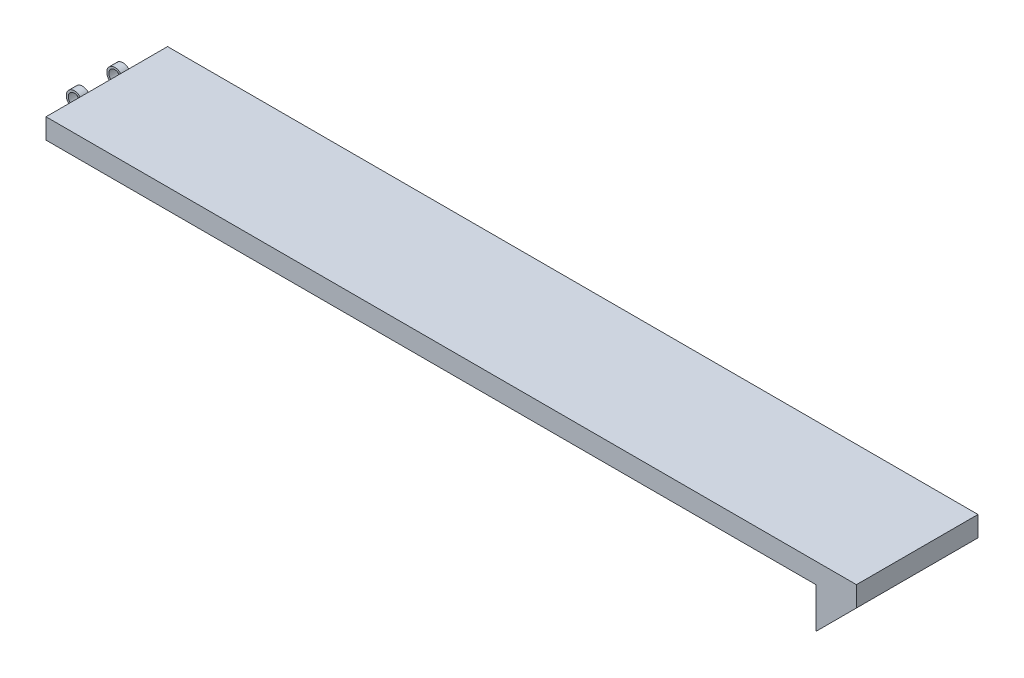
ISO-10303-21;
HEADER;
FILE_DESCRIPTION(('STEP AP214'),'2;1');
FILE_NAME('part.step','',(''),(''),'','','');
FILE_SCHEMA(('AUTOMOTIVE_DESIGN { 1 0 10303 214 1 1 1 1 }'));
ENDSEC;
DATA;
#1=APPLICATION_CONTEXT('core data for automotive mechanical design processes');
#2=APPLICATION_PROTOCOL_DEFINITION('international standard','automotive_design',2000,#1);
#3=PRODUCT_CONTEXT('',#1,'mechanical');
#4=PRODUCT('Part','Part','',(#3));
#5=PRODUCT_RELATED_PRODUCT_CATEGORY('part','',(#4));
#6=PRODUCT_DEFINITION_FORMATION('','',#4);
#7=PRODUCT_DEFINITION_CONTEXT('part definition',#1,'design');
#8=PRODUCT_DEFINITION('design','',#6,#7);
#9=PRODUCT_DEFINITION_SHAPE('','',#8);
#10=(LENGTH_UNIT() NAMED_UNIT(*) SI_UNIT(.MILLI.,.METRE.));
#11=(NAMED_UNIT(*) PLANE_ANGLE_UNIT() SI_UNIT($,.RADIAN.));
#12=(NAMED_UNIT(*) SI_UNIT($,.STERADIAN.) SOLID_ANGLE_UNIT());
#13=UNCERTAINTY_MEASURE_WITH_UNIT(LENGTH_MEASURE(1.E-05),#10,'distance_accuracy_value','');
#14=(GEOMETRIC_REPRESENTATION_CONTEXT(3) GLOBAL_UNCERTAINTY_ASSIGNED_CONTEXT((#13)) GLOBAL_UNIT_ASSIGNED_CONTEXT((#10,
#11,#12)) REPRESENTATION_CONTEXT('',''));
#15=CARTESIAN_POINT('',(0.,0.,0.));
#16=DIRECTION('',(0.,0.,1.));
#17=DIRECTION('',(1.,0.,0.));
#18=AXIS2_PLACEMENT_3D('',#15,#16,#17);
#19=CARTESIAN_POINT('',(-2.54,3.87278977502286,-26.67));
#20=DIRECTION('',(0.,0.,1.));
#21=DIRECTION('',(1.,0.,0.));
#22=AXIS2_PLACEMENT_3D('',#19,#20,#21);
#23=CYLINDRICAL_SURFACE('',#22,2.54);
#24=CARTESIAN_POINT('',(-2.54,3.87278977502286,-26.67));
#25=DIRECTION('',(0.,0.,1.));
#26=DIRECTION('',(1.,0.,0.));
#27=AXIS2_PLACEMENT_3D('',#24,#25,#26);
#28=CIRCLE('',#27,2.54);
#29=CARTESIAN_POINT('',(0.,3.87278977502286,-26.67));
#30=VERTEX_POINT('',#29);
#31=EDGE_CURVE('E11',#30,#30,#28,.T.);
#32=ORIENTED_EDGE('',*,*,#31,.T.);
#33=EDGE_LOOP('',(#32));
#34=FACE_BOUND('',#33,.T.);
#35=CARTESIAN_POINT('',(-2.54,3.87278977502286,-24.13));
#36=DIRECTION('',(0.,0.,1.));
#37=DIRECTION('',(1.,0.,0.));
#38=AXIS2_PLACEMENT_3D('',#35,#36,#37);
#39=CIRCLE('',#38,2.54);
#40=CARTESIAN_POINT('',(0.,3.87278977502286,-24.13));
#41=VERTEX_POINT('',#40);
#42=EDGE_CURVE('E50',#41,#41,#39,.T.);
#43=ORIENTED_EDGE('',*,*,#42,.F.);
#44=EDGE_LOOP('',(#43));
#45=FACE_BOUND('',#44,.T.);
#46=ADVANCED_FACE('F40',(#34,#45),#23,.T.);
#47=CARTESIAN_POINT('',(-2.54,3.87278977502286,-26.67));
#48=DIRECTION('',(0.,0.,1.));
#49=DIRECTION('',(1.,0.,0.));
#50=AXIS2_PLACEMENT_3D('',#47,#48,#49);
#51=PLANE('',#50);
#52=CARTESIAN_POINT('',(-2.54,3.87278977502286,-26.67));
#53=DIRECTION('',(0.,0.,1.));
#54=DIRECTION('',(1.,0.,0.));
#55=AXIS2_PLACEMENT_3D('',#52,#53,#54);
#56=CIRCLE('',#55,1.905);
#57=CARTESIAN_POINT('',(-0.635000000000001,3.87278977502286,-26.67));
#58=VERTEX_POINT('',#57);
#59=EDGE_CURVE('E46',#58,#58,#56,.T.);
#60=ORIENTED_EDGE('',*,*,#59,.T.);
#61=EDGE_LOOP('',(#60));
#62=FACE_BOUND('',#61,.T.);
#63=ORIENTED_EDGE('',*,*,#31,.F.);
#64=EDGE_LOOP('',(#63));
#65=FACE_BOUND('',#64,.T.);
#66=ADVANCED_FACE('F69',(#62,#65),#51,.F.);
#67=CARTESIAN_POINT('',(-2.54,3.87278977502286,-26.67));
#68=DIRECTION('',(0.,0.,1.));
#69=DIRECTION('',(1.,0.,0.));
#70=AXIS2_PLACEMENT_3D('',#67,#68,#69);
#71=CYLINDRICAL_SURFACE('',#70,1.905);
#72=ORIENTED_EDGE('',*,*,#59,.F.);
#73=EDGE_LOOP('',(#72));
#74=FACE_BOUND('',#73,.T.);
#75=CARTESIAN_POINT('',(-2.54,3.87278977502286,-24.13));
#76=DIRECTION('',(0.,0.,1.));
#77=DIRECTION('',(1.,0.,0.));
#78=AXIS2_PLACEMENT_3D('',#75,#76,#77);
#79=CIRCLE('',#78,1.905);
#80=CARTESIAN_POINT('',(-0.635000000000001,3.87278977502286,-24.13));
#81=VERTEX_POINT('',#80);
#82=EDGE_CURVE('E54',#81,#81,#79,.T.);
#83=ORIENTED_EDGE('',*,*,#82,.T.);
#84=EDGE_LOOP('',(#83));
#85=FACE_BOUND('',#84,.T.);
#86=ADVANCED_FACE('F60',(#74,#85),#71,.F.);
#87=CARTESIAN_POINT('',(-2.54,3.87278977502286,-24.13));
#88=DIRECTION('',(0.,0.,1.));
#89=DIRECTION('',(1.,0.,0.));
#90=AXIS2_PLACEMENT_3D('',#87,#88,#89);
#91=PLANE('',#90);
#92=ORIENTED_EDGE('',*,*,#42,.T.);
#93=EDGE_LOOP('',(#92));
#94=FACE_BOUND('',#93,.T.);
#95=ORIENTED_EDGE('',*,*,#82,.F.);
#96=EDGE_LOOP('',(#95));
#97=FACE_BOUND('',#96,.T.);
#98=ADVANCED_FACE('F62',(#94,#97),#91,.T.);
#99=CLOSED_SHELL('',(#46,#66,#86,#98));
#100=MANIFOLD_SOLID_BREP('B2',#99);
#101=CARTESIAN_POINT('',(-2.54,3.87278977502286,-13.97));
#102=DIRECTION('',(0.,0.,1.));
#103=DIRECTION('',(1.,0.,0.));
#104=AXIS2_PLACEMENT_3D('',#101,#102,#103);
#105=CYLINDRICAL_SURFACE('',#104,2.54);
#106=CARTESIAN_POINT('',(-2.54,3.87278977502286,-13.97));
#107=DIRECTION('',(0.,0.,1.));
#108=DIRECTION('',(1.,0.,0.));
#109=AXIS2_PLACEMENT_3D('',#106,#107,#108);
#110=CIRCLE('',#109,2.54);
#111=CARTESIAN_POINT('',(0.,3.87278977502286,-13.97));
#112=VERTEX_POINT('',#111);
#113=EDGE_CURVE('E39',#112,#112,#110,.T.);
#114=ORIENTED_EDGE('',*,*,#113,.T.);
#115=EDGE_LOOP('',(#114));
#116=FACE_BOUND('',#115,.T.);
#117=CARTESIAN_POINT('',(-2.54,3.87278977502286,-11.43));
#118=DIRECTION('',(0.,0.,1.));
#119=DIRECTION('',(1.,0.,0.));
#120=AXIS2_PLACEMENT_3D('',#117,#118,#119);
#121=CIRCLE('',#120,2.54);
#122=CARTESIAN_POINT('',(0.,3.87278977502286,-11.43));
#123=VERTEX_POINT('',#122);
#124=EDGE_CURVE('E121',#123,#123,#121,.T.);
#125=ORIENTED_EDGE('',*,*,#124,.F.);
#126=EDGE_LOOP('',(#125));
#127=FACE_BOUND('',#126,.T.);
#128=ADVANCED_FACE('F111',(#116,#127),#105,.T.);
#129=CARTESIAN_POINT('',(-2.54,3.87278977502286,-13.97));
#130=DIRECTION('',(0.,0.,1.));
#131=DIRECTION('',(1.,0.,0.));
#132=AXIS2_PLACEMENT_3D('',#129,#130,#131);
#133=PLANE('',#132);
#134=CARTESIAN_POINT('',(-2.54,3.87278977502286,-13.97));
#135=DIRECTION('',(0.,0.,1.));
#136=DIRECTION('',(1.,0.,0.));
#137=AXIS2_PLACEMENT_3D('',#134,#135,#136);
#138=CIRCLE('',#137,1.905);
#139=CARTESIAN_POINT('',(-0.635000000000001,3.87278977502286,-13.97));
#140=VERTEX_POINT('',#139);
#141=EDGE_CURVE('E117',#140,#140,#138,.T.);
#142=ORIENTED_EDGE('',*,*,#141,.T.);
#143=EDGE_LOOP('',(#142));
#144=FACE_BOUND('',#143,.T.);
#145=ORIENTED_EDGE('',*,*,#113,.F.);
#146=EDGE_LOOP('',(#145));
#147=FACE_BOUND('',#146,.T.);
#148=ADVANCED_FACE('F140',(#144,#147),#133,.F.);
#149=CARTESIAN_POINT('',(-2.54,3.87278977502286,-13.97));
#150=DIRECTION('',(0.,0.,1.));
#151=DIRECTION('',(1.,0.,0.));
#152=AXIS2_PLACEMENT_3D('',#149,#150,#151);
#153=CYLINDRICAL_SURFACE('',#152,1.905);
#154=ORIENTED_EDGE('',*,*,#141,.F.);
#155=EDGE_LOOP('',(#154));
#156=FACE_BOUND('',#155,.T.);
#157=CARTESIAN_POINT('',(-2.54,3.87278977502286,-11.43));
#158=DIRECTION('',(0.,0.,1.));
#159=DIRECTION('',(1.,0.,0.));
#160=AXIS2_PLACEMENT_3D('',#157,#158,#159);
#161=CIRCLE('',#160,1.905);
#162=CARTESIAN_POINT('',(-0.635000000000001,3.87278977502286,-11.43));
#163=VERTEX_POINT('',#162);
#164=EDGE_CURVE('E125',#163,#163,#161,.T.);
#165=ORIENTED_EDGE('',*,*,#164,.T.);
#166=EDGE_LOOP('',(#165));
#167=FACE_BOUND('',#166,.T.);
#168=ADVANCED_FACE('F131',(#156,#167),#153,.F.);
#169=CARTESIAN_POINT('',(-2.54,3.87278977502286,-11.43));
#170=DIRECTION('',(0.,0.,1.));
#171=DIRECTION('',(1.,0.,0.));
#172=AXIS2_PLACEMENT_3D('',#169,#170,#171);
#173=PLANE('',#172);
#174=ORIENTED_EDGE('',*,*,#124,.T.);
#175=EDGE_LOOP('',(#174));
#176=FACE_BOUND('',#175,.T.);
#177=ORIENTED_EDGE('',*,*,#164,.F.);
#178=EDGE_LOOP('',(#177));
#179=FACE_BOUND('',#178,.T.);
#180=ADVANCED_FACE('F133',(#176,#179),#173,.T.);
#181=CLOSED_SHELL('',(#128,#148,#168,#180));
#182=MANIFOLD_SOLID_BREP('B6',#181);
#183=CARTESIAN_POINT('',(0.,6.35,0.));
#184=DIRECTION('',(1.,0.,0.));
#185=DIRECTION('',(0.,0.,-1.));
#186=AXIS2_PLACEMENT_3D('',#183,#184,#185);
#187=PLANE('',#186);
#188=DIRECTION('',(0.,0.,1.));
#189=VECTOR('',#188,1.);
#190=CARTESIAN_POINT('',(0.,0.,0.));
#191=LINE('',#190,#189);
#192=CARTESIAN_POINT('',(0.,0.,-38.1));
#193=VERTEX_POINT('',#192);
#194=CARTESIAN_POINT('',(0.,0.,0.));
#195=VERTEX_POINT('',#194);
#196=EDGE_CURVE('E238',#193,#195,#191,.T.);
#197=ORIENTED_EDGE('',*,*,#196,.T.);
#198=DIRECTION('',(0.,-1.,0.));
#199=VECTOR('',#198,1.);
#200=CARTESIAN_POINT('',(0.,6.35,0.));
#201=LINE('',#200,#199);
#202=CARTESIAN_POINT('',(0.,6.35,0.));
#203=VERTEX_POINT('',#202);
#204=EDGE_CURVE('E228',#203,#195,#201,.T.);
#205=ORIENTED_EDGE('',*,*,#204,.F.);
#206=DIRECTION('',(0.,0.,1.));
#207=VECTOR('',#206,1.);
#208=CARTESIAN_POINT('',(0.,6.35,0.));
#209=LINE('',#208,#207);
#210=CARTESIAN_POINT('',(0.,6.35,-38.1));
#211=VERTEX_POINT('',#210);
#212=EDGE_CURVE('E249',#211,#203,#209,.T.);
#213=ORIENTED_EDGE('',*,*,#212,.F.);
#214=DIRECTION('',(0.,-1.,0.));
#215=VECTOR('',#214,1.);
#216=CARTESIAN_POINT('',(0.,6.35,-38.1));
#217=LINE('',#216,#215);
#218=EDGE_CURVE('E259',#211,#193,#217,.T.);
#219=ORIENTED_EDGE('',*,*,#218,.T.);
#220=EDGE_LOOP('',(#197,#205,#213,#219));
#221=FACE_BOUND('',#220,.T.);
#222=ADVANCED_FACE('F173',(#221),#187,.F.);
#223=CARTESIAN_POINT('',(0.,6.35,0.));
#224=DIRECTION('',(0.,0.,-1.));
#225=DIRECTION('',(-1.,0.,0.));
#226=AXIS2_PLACEMENT_3D('',#223,#224,#225);
#227=PLANE('',#226);
#228=DIRECTION('',(0.,1.,0.));
#229=VECTOR('',#228,1.);
#230=CARTESIAN_POINT('',(241.3,-12.7,0.));
#231=LINE('',#230,#229);
#232=CARTESIAN_POINT('',(241.3,-12.7,0.));
#233=VERTEX_POINT('',#232);
#234=CARTESIAN_POINT('',(241.3,0.,0.));
#235=VERTEX_POINT('',#234);
#236=EDGE_CURVE('E232',#233,#235,#231,.T.);
#237=ORIENTED_EDGE('',*,*,#236,.F.);
#238=DIRECTION('',(-0.707106781186545,-0.70710678118655,0.));
#239=VECTOR('',#238,1.);
#240=CARTESIAN_POINT('',(241.3,-12.7,0.));
#241=LINE('',#240,#239);
#242=CARTESIAN_POINT('',(254.,0.,0.));
#243=VERTEX_POINT('',#242);
#244=EDGE_CURVE('E195',#233,#243,#241,.F.);
#245=ORIENTED_EDGE('',*,*,#244,.T.);
#246=DIRECTION('',(0.,-1.,0.));
#247=VECTOR('',#246,1.);
#248=CARTESIAN_POINT('',(254.,6.35,0.));
#249=LINE('',#248,#247);
#250=CARTESIAN_POINT('',(254.,6.35,0.));
#251=VERTEX_POINT('',#250);
#252=EDGE_CURVE('E268',#251,#243,#249,.T.);
#253=ORIENTED_EDGE('',*,*,#252,.F.);
#254=DIRECTION('',(1.,0.,0.));
#255=VECTOR('',#254,1.);
#256=CARTESIAN_POINT('',(0.,6.35,0.));
#257=LINE('',#256,#255);
#258=EDGE_CURVE('E252',#203,#251,#257,.T.);
#259=ORIENTED_EDGE('',*,*,#258,.F.);
#260=ORIENTED_EDGE('',*,*,#204,.T.);
#261=DIRECTION('',(1.,0.,0.));
#262=VECTOR('',#261,1.);
#263=CARTESIAN_POINT('',(0.,0.,0.));
#264=LINE('',#263,#262);
#265=EDGE_CURVE('E235',#195,#235,#264,.T.);
#266=ORIENTED_EDGE('',*,*,#265,.T.);
#267=EDGE_LOOP('',(#237,#245,#253,#259,#260,#266));
#268=FACE_BOUND('',#267,.T.);
#269=ADVANCED_FACE('F233',(#268),#227,.F.);
#270=CARTESIAN_POINT('',(254.,6.35,0.));
#271=DIRECTION('',(-1.,0.,0.));
#272=DIRECTION('',(0.,0.,1.));
#273=AXIS2_PLACEMENT_3D('',#270,#271,#272);
#274=PLANE('',#273);
#275=ORIENTED_EDGE('',*,*,#252,.T.);
#276=DIRECTION('',(0.,0.,-1.));
#277=VECTOR('',#276,1.);
#278=CARTESIAN_POINT('',(254.,0.,0.));
#279=LINE('',#278,#277);
#280=CARTESIAN_POINT('',(254.,0.,-38.1));
#281=VERTEX_POINT('',#280);
#282=EDGE_CURVE('E181',#243,#281,#279,.T.);
#283=ORIENTED_EDGE('',*,*,#282,.T.);
#284=DIRECTION('',(0.,-1.,0.));
#285=VECTOR('',#284,1.);
#286=CARTESIAN_POINT('',(254.,6.35,-38.1));
#287=LINE('',#286,#285);
#288=CARTESIAN_POINT('',(254.,6.35,-38.1));
#289=VERTEX_POINT('',#288);
#290=EDGE_CURVE('E266',#289,#281,#287,.T.);
#291=ORIENTED_EDGE('',*,*,#290,.F.);
#292=DIRECTION('',(0.,0.,-1.));
#293=VECTOR('',#292,1.);
#294=CARTESIAN_POINT('',(254.,6.35,0.));
#295=LINE('',#294,#293);
#296=EDGE_CURVE('E255',#251,#289,#295,.T.);
#297=ORIENTED_EDGE('',*,*,#296,.F.);
#298=EDGE_LOOP('',(#275,#283,#291,#297));
#299=FACE_BOUND('',#298,.T.);
#300=ADVANCED_FACE('F281',(#299),#274,.F.);
#301=CARTESIAN_POINT('',(0.,6.35,-38.1));
#302=DIRECTION('',(0.,0.,1.));
#303=DIRECTION('',(1.,0.,0.));
#304=AXIS2_PLACEMENT_3D('',#301,#302,#303);
#305=PLANE('',#304);
#306=ORIENTED_EDGE('',*,*,#290,.T.);
#307=DIRECTION('',(0.707106781186545,0.70710678118655,0.));
#308=VECTOR('',#307,1.);
#309=CARTESIAN_POINT('',(241.3,-12.7,-38.1));
#310=LINE('',#309,#308);
#311=CARTESIAN_POINT('',(241.3,-12.7,-38.1));
#312=VERTEX_POINT('',#311);
#313=EDGE_CURVE('E109',#281,#312,#310,.F.);
#314=ORIENTED_EDGE('',*,*,#313,.T.);
#315=DIRECTION('',(0.,1.,0.));
#316=VECTOR('',#315,1.);
#317=CARTESIAN_POINT('',(241.3,-12.7,-38.1));
#318=LINE('',#317,#316);
#319=CARTESIAN_POINT('',(241.3,0.,-38.1));
#320=VERTEX_POINT('',#319);
#321=EDGE_CURVE('E239',#312,#320,#318,.T.);
#322=ORIENTED_EDGE('',*,*,#321,.T.);
#323=DIRECTION('',(-1.,0.,0.));
#324=VECTOR('',#323,1.);
#325=CARTESIAN_POINT('',(0.,0.,-38.1));
#326=LINE('',#325,#324);
#327=EDGE_CURVE('E253',#320,#193,#326,.T.);
#328=ORIENTED_EDGE('',*,*,#327,.T.);
#329=ORIENTED_EDGE('',*,*,#218,.F.);
#330=DIRECTION('',(-1.,0.,0.));
#331=VECTOR('',#330,1.);
#332=CARTESIAN_POINT('',(0.,6.35,-38.1));
#333=LINE('',#332,#331);
#334=EDGE_CURVE('E257',#289,#211,#333,.T.);
#335=ORIENTED_EDGE('',*,*,#334,.F.);
#336=EDGE_LOOP('',(#306,#314,#322,#328,#329,#335));
#337=FACE_BOUND('',#336,.T.);
#338=ADVANCED_FACE('F278',(#337),#305,.F.);
#339=CARTESIAN_POINT('',(0.,6.35,0.));
#340=DIRECTION('',(0.,-1.,0.));
#341=DIRECTION('',(0.,0.,-1.));
#342=AXIS2_PLACEMENT_3D('',#339,#340,#341);
#343=PLANE('',#342);
#344=ORIENTED_EDGE('',*,*,#212,.T.);
#345=ORIENTED_EDGE('',*,*,#258,.T.);
#346=ORIENTED_EDGE('',*,*,#296,.T.);
#347=ORIENTED_EDGE('',*,*,#334,.T.);
#348=EDGE_LOOP('',(#344,#345,#346,#347));
#349=FACE_BOUND('',#348,.T.);
#350=ADVANCED_FACE('F283',(#349),#343,.F.);
#351=CARTESIAN_POINT('',(0.,0.,0.));
#352=DIRECTION('',(0.,-1.,0.));
#353=DIRECTION('',(0.,0.,-1.));
#354=AXIS2_PLACEMENT_3D('',#351,#352,#353);
#355=PLANE('',#354);
#356=DIRECTION('',(0.,0.,-1.));
#357=VECTOR('',#356,1.);
#358=CARTESIAN_POINT('',(241.3,0.,0.));
#359=LINE('',#358,#357);
#360=EDGE_CURVE('E244',#235,#320,#359,.T.);
#361=ORIENTED_EDGE('',*,*,#360,.F.);
#362=ORIENTED_EDGE('',*,*,#265,.F.);
#363=ORIENTED_EDGE('',*,*,#196,.F.);
#364=ORIENTED_EDGE('',*,*,#327,.F.);
#365=EDGE_LOOP('',(#361,#362,#363,#364));
#366=FACE_BOUND('',#365,.T.);
#367=ADVANCED_FACE('F276',(#366),#355,.T.);
#368=CARTESIAN_POINT('',(241.3,-12.7,0.));
#369=DIRECTION('',(1.,0.,0.));
#370=DIRECTION('',(0.,0.,-1.));
#371=AXIS2_PLACEMENT_3D('',#368,#369,#370);
#372=PLANE('',#371);
#373=ORIENTED_EDGE('',*,*,#360,.T.);
#374=ORIENTED_EDGE('',*,*,#321,.F.);
#375=DIRECTION('',(0.,0.,-1.));
#376=VECTOR('',#375,1.);
#377=CARTESIAN_POINT('',(241.3,-12.7,0.));
#378=LINE('',#377,#376);
#379=EDGE_CURVE('E227',#233,#312,#378,.T.);
#380=ORIENTED_EDGE('',*,*,#379,.F.);
#381=ORIENTED_EDGE('',*,*,#236,.T.);
#382=EDGE_LOOP('',(#373,#374,#380,#381));
#383=FACE_BOUND('',#382,.T.);
#384=ADVANCED_FACE('F242',(#383),#372,.F.);
#385=CARTESIAN_POINT('',(241.3,-12.7,0.));
#386=DIRECTION('',(-0.70710678118655,0.707106781186545,0.));
#387=DIRECTION('',(0.,0.,1.));
#388=AXIS2_PLACEMENT_3D('',#385,#386,#387);
#389=PLANE('',#388);
#390=ORIENTED_EDGE('',*,*,#313,.F.);
#391=ORIENTED_EDGE('',*,*,#282,.F.);
#392=ORIENTED_EDGE('',*,*,#244,.F.);
#393=ORIENTED_EDGE('',*,*,#379,.T.);
#394=EDGE_LOOP('',(#390,#391,#392,#393));
#395=FACE_BOUND('',#394,.T.);
#396=ADVANCED_FACE('F175',(#395),#389,.F.);
#397=CLOSED_SHELL('',(#222,#269,#300,#338,#350,#367,#384,#396));
#398=MANIFOLD_SOLID_BREP('B34',#397);
#399=ADVANCED_BREP_SHAPE_REPRESENTATION('',(#18,#100,#182,#398),#14);
#400=SHAPE_DEFINITION_REPRESENTATION(#9,#399);
ENDSEC;
END-ISO-10303-21;
